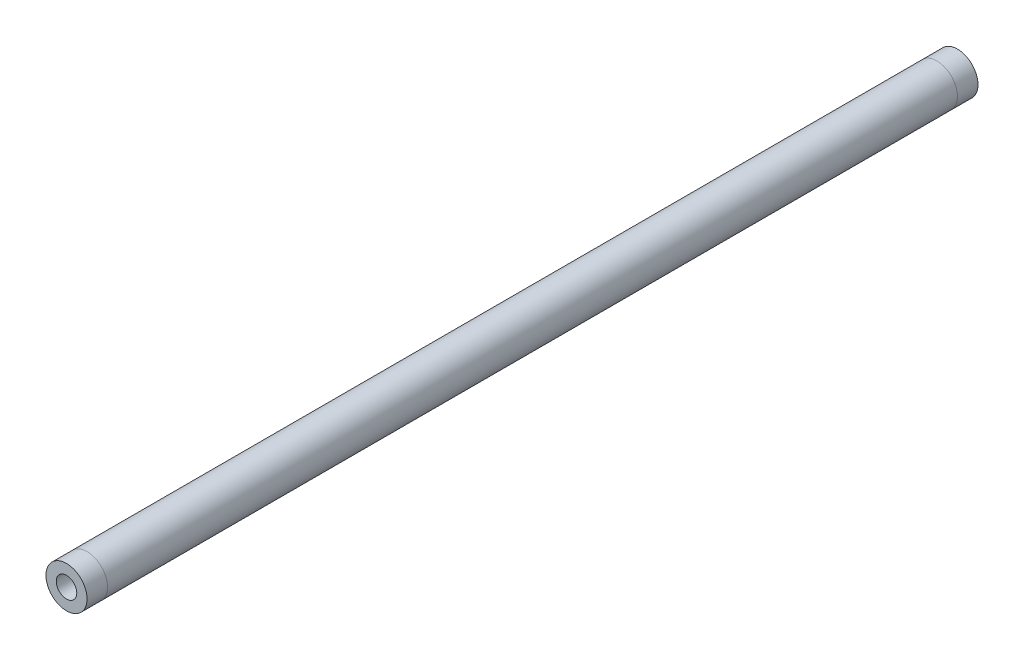
ISO-10303-21;
HEADER;
FILE_DESCRIPTION(('STEP AP214'),'2;1');
FILE_NAME('part.step','',(''),(''),'','','');
FILE_SCHEMA(('AUTOMOTIVE_DESIGN { 1 0 10303 214 1 1 1 1 }'));
ENDSEC;
DATA;
#1=APPLICATION_CONTEXT('core data for automotive mechanical design processes');
#2=APPLICATION_PROTOCOL_DEFINITION('international standard','automotive_design',2000,#1);
#3=PRODUCT_CONTEXT('',#1,'mechanical');
#4=PRODUCT('Part','Part','',(#3));
#5=PRODUCT_RELATED_PRODUCT_CATEGORY('part','',(#4));
#6=PRODUCT_DEFINITION_FORMATION('','',#4);
#7=PRODUCT_DEFINITION_CONTEXT('part definition',#1,'design');
#8=PRODUCT_DEFINITION('design','',#6,#7);
#9=PRODUCT_DEFINITION_SHAPE('','',#8);
#10=(LENGTH_UNIT() NAMED_UNIT(*) SI_UNIT(.MILLI.,.METRE.));
#11=(NAMED_UNIT(*) PLANE_ANGLE_UNIT() SI_UNIT($,.RADIAN.));
#12=(NAMED_UNIT(*) SI_UNIT($,.STERADIAN.) SOLID_ANGLE_UNIT());
#13=UNCERTAINTY_MEASURE_WITH_UNIT(LENGTH_MEASURE(1.E-05),#10,'distance_accuracy_value','');
#14=(GEOMETRIC_REPRESENTATION_CONTEXT(3) GLOBAL_UNCERTAINTY_ASSIGNED_CONTEXT((#13)) GLOBAL_UNIT_ASSIGNED_CONTEXT((#10,
#11,#12)) REPRESENTATION_CONTEXT('',''));
#15=CARTESIAN_POINT('',(0.,0.,0.));
#16=DIRECTION('',(0.,0.,1.));
#17=DIRECTION('',(1.,0.,0.));
#18=AXIS2_PLACEMENT_3D('',#15,#16,#17);
#19=CARTESIAN_POINT('',(0.,0.,-275.364017953208));
#20=DIRECTION('',(0.,0.,1.));
#21=DIRECTION('',(1.,0.,0.));
#22=AXIS2_PLACEMENT_3D('',#19,#20,#21);
#23=CYLINDRICAL_SURFACE('',#22,6.35);
#24=CARTESIAN_POINT('',(0.,0.,-275.364017953208));
#25=DIRECTION('',(0.,0.,1.));
#26=DIRECTION('',(1.,0.,0.));
#27=AXIS2_PLACEMENT_3D('',#24,#25,#26);
#28=CIRCLE('',#27,6.35);
#29=CARTESIAN_POINT('',(6.35,0.,-275.364017953208));
#30=VERTEX_POINT('',#29);
#31=EDGE_CURVE('E89',#30,#30,#28,.T.);
#32=ORIENTED_EDGE('',*,*,#31,.T.);
#33=EDGE_LOOP('',(#32));
#34=FACE_BOUND('',#33,.T.);
#35=CARTESIAN_POINT('',(0.,0.,-269.014017953208));
#36=DIRECTION('',(0.,0.,1.));
#37=DIRECTION('',(1.,0.,0.));
#38=AXIS2_PLACEMENT_3D('',#35,#36,#37);
#39=CIRCLE('',#38,6.35);
#40=CARTESIAN_POINT('',(6.35,0.,-269.014017953208));
#41=VERTEX_POINT('',#40);
#42=EDGE_CURVE('E85',#41,#41,#39,.T.);
#43=ORIENTED_EDGE('',*,*,#42,.F.);
#44=EDGE_LOOP('',(#43));
#45=FACE_BOUND('',#44,.T.);
#46=ADVANCED_FACE('F82',(#34,#45),#23,.T.);
#47=CARTESIAN_POINT('',(0.,0.,-275.364017953208));
#48=DIRECTION('',(0.,0.,1.));
#49=DIRECTION('',(1.,0.,0.));
#50=AXIS2_PLACEMENT_3D('',#47,#48,#49);
#51=PLANE('',#50);
#52=CARTESIAN_POINT('',(0.,0.,-275.364017953208));
#53=DIRECTION('',(0.,0.,1.));
#54=DIRECTION('',(1.,0.,0.));
#55=AXIS2_PLACEMENT_3D('',#52,#53,#54);
#56=CIRCLE('',#55,3.175);
#57=CARTESIAN_POINT('',(3.175,0.,-275.364017953208));
#58=VERTEX_POINT('',#57);
#59=EDGE_CURVE('E98',#58,#58,#56,.T.);
#60=ORIENTED_EDGE('',*,*,#59,.T.);
#61=EDGE_LOOP('',(#60));
#62=FACE_BOUND('',#61,.T.);
#63=ORIENTED_EDGE('',*,*,#31,.F.);
#64=EDGE_LOOP('',(#63));
#65=FACE_BOUND('',#64,.T.);
#66=ADVANCED_FACE('F125',(#62,#65),#51,.F.);
#67=CARTESIAN_POINT('',(0.,0.,-269.014017953208));
#68=DIRECTION('',(0.,0.,1.));
#69=DIRECTION('',(1.,0.,0.));
#70=AXIS2_PLACEMENT_3D('',#67,#68,#69);
#71=PLANE('',#70);
#72=CARTESIAN_POINT('',(0.,0.,-269.014017953208));
#73=DIRECTION('',(0.,0.,1.));
#74=DIRECTION('',(1.,0.,0.));
#75=AXIS2_PLACEMENT_3D('',#72,#73,#74);
#76=CIRCLE('',#75,5.461);
#77=CARTESIAN_POINT('',(-5.461,0.,-269.014017953208));
#78=VERTEX_POINT('',#77);
#79=EDGE_CURVE('E12',#78,#78,#76,.T.);
#80=ORIENTED_EDGE('',*,*,#79,.F.);
#81=EDGE_LOOP('',(#80));
#82=FACE_BOUND('',#81,.T.);
#83=ORIENTED_EDGE('',*,*,#42,.T.);
#84=EDGE_LOOP('',(#83));
#85=FACE_BOUND('',#84,.T.);
#86=ADVANCED_FACE('F121',(#82,#85),#71,.T.);
#87=CARTESIAN_POINT('',(0.,0.,-275.364017953208));
#88=DIRECTION('',(0.,0.,1.));
#89=DIRECTION('',(1.,0.,0.));
#90=AXIS2_PLACEMENT_3D('',#87,#88,#89);
#91=CYLINDRICAL_SURFACE('',#90,3.175);
#92=ORIENTED_EDGE('',*,*,#59,.F.);
#93=EDGE_LOOP('',(#92));
#94=FACE_BOUND('',#93,.T.);
#95=CARTESIAN_POINT('',(0.,0.,-259.489017953208));
#96=DIRECTION('',(0.,0.,1.));
#97=DIRECTION('',(1.,0.,0.));
#98=AXIS2_PLACEMENT_3D('',#95,#96,#97);
#99=CIRCLE('',#98,3.175);
#100=CARTESIAN_POINT('',(3.175,0.,-259.489017953208));
#101=VERTEX_POINT('',#100);
#102=EDGE_CURVE('E104',#101,#101,#99,.T.);
#103=ORIENTED_EDGE('',*,*,#102,.T.);
#104=EDGE_LOOP('',(#103));
#105=FACE_BOUND('',#104,.T.);
#106=ADVANCED_FACE('F110',(#94,#105),#91,.F.);
#107=CARTESIAN_POINT('',(0.,0.,-259.489017953208));
#108=DIRECTION('',(0.,0.,1.));
#109=DIRECTION('',(1.,0.,0.));
#110=AXIS2_PLACEMENT_3D('',#107,#108,#109);
#111=PLANE('',#110);
#112=CARTESIAN_POINT('',(0.,0.,-259.489017953208));
#113=DIRECTION('',(0.,0.,1.));
#114=DIRECTION('',(1.,0.,0.));
#115=AXIS2_PLACEMENT_3D('',#112,#113,#114);
#116=CIRCLE('',#115,5.461);
#117=CARTESIAN_POINT('',(-5.461,0.,-259.489017953208));
#118=VERTEX_POINT('',#117);
#119=EDGE_CURVE('E96',#118,#118,#116,.T.);
#120=ORIENTED_EDGE('',*,*,#119,.T.);
#121=EDGE_LOOP('',(#120));
#122=FACE_BOUND('',#121,.T.);
#123=ORIENTED_EDGE('',*,*,#102,.F.);
#124=EDGE_LOOP('',(#123));
#125=FACE_BOUND('',#124,.T.);
#126=ADVANCED_FACE('F112',(#122,#125),#111,.T.);
#127=CARTESIAN_POINT('',(0.,0.,-259.489017953208));
#128=DIRECTION('',(0.,0.,-1.));
#129=DIRECTION('',(-1.,0.,0.));
#130=AXIS2_PLACEMENT_3D('',#127,#128,#129);
#131=CYLINDRICAL_SURFACE('',#130,5.461);
#132=CARTESIAN_POINT('',(-5.461,0.,-259.489017953208));
#133=CARTESIAN_POINT('',(-5.461,0.,-259.588236703208));
#134=CARTESIAN_POINT('',(-5.461,0.,-259.687455453208));
#135=CARTESIAN_POINT('',(-5.461,0.,-259.885892953208));
#136=CARTESIAN_POINT('',(-5.461,0.,-259.985111703208));
#137=CARTESIAN_POINT('',(-5.461,0.,-260.183549203208));
#138=CARTESIAN_POINT('',(-5.461,0.,-260.282767953208));
#139=CARTESIAN_POINT('',(-5.461,0.,-260.481205453208));
#140=CARTESIAN_POINT('',(-5.461,0.,-260.580424203208));
#141=CARTESIAN_POINT('',(-5.461,0.,-260.778861703208));
#142=CARTESIAN_POINT('',(-5.461,0.,-260.878080453208));
#143=CARTESIAN_POINT('',(-5.461,0.,-261.076517953208));
#144=CARTESIAN_POINT('',(-5.461,0.,-261.175736703208));
#145=CARTESIAN_POINT('',(-5.461,0.,-261.374174203208));
#146=CARTESIAN_POINT('',(-5.461,0.,-261.473392953208));
#147=CARTESIAN_POINT('',(-5.461,0.,-261.671830453208));
#148=CARTESIAN_POINT('',(-5.461,0.,-261.771049203208));
#149=CARTESIAN_POINT('',(-5.461,0.,-261.969486703208));
#150=CARTESIAN_POINT('',(-5.461,0.,-262.068705453208));
#151=CARTESIAN_POINT('',(-5.461,0.,-262.267142953208));
#152=CARTESIAN_POINT('',(-5.461,0.,-262.366361703208));
#153=CARTESIAN_POINT('',(-5.461,0.,-262.564799203208));
#154=CARTESIAN_POINT('',(-5.461,0.,-262.664017953208));
#155=CARTESIAN_POINT('',(-5.461,0.,-262.862455453208));
#156=CARTESIAN_POINT('',(-5.461,0.,-262.961674203208));
#157=CARTESIAN_POINT('',(-5.461,0.,-263.160111703208));
#158=CARTESIAN_POINT('',(-5.461,0.,-263.259330453208));
#159=CARTESIAN_POINT('',(-5.461,0.,-263.457767953208));
#160=CARTESIAN_POINT('',(-5.461,0.,-263.556986703208));
#161=CARTESIAN_POINT('',(-5.461,0.,-263.755424203208));
#162=CARTESIAN_POINT('',(-5.461,0.,-263.854642953208));
#163=CARTESIAN_POINT('',(-5.461,0.,-264.053080453208));
#164=CARTESIAN_POINT('',(-5.461,0.,-264.152299203208));
#165=CARTESIAN_POINT('',(-5.461,0.,-264.350736703208));
#166=CARTESIAN_POINT('',(-5.461,0.,-264.449955453208));
#167=CARTESIAN_POINT('',(-5.461,0.,-264.648392953208));
#168=CARTESIAN_POINT('',(-5.461,0.,-264.747611703208));
#169=CARTESIAN_POINT('',(-5.461,0.,-264.946049203208));
#170=CARTESIAN_POINT('',(-5.461,0.,-265.045267953208));
#171=CARTESIAN_POINT('',(-5.461,0.,-265.243705453208));
#172=CARTESIAN_POINT('',(-5.461,0.,-265.342924203208));
#173=CARTESIAN_POINT('',(-5.461,0.,-265.541361703208));
#174=CARTESIAN_POINT('',(-5.461,0.,-265.640580453208));
#175=CARTESIAN_POINT('',(-5.461,0.,-265.839017953208));
#176=CARTESIAN_POINT('',(-5.461,0.,-265.938236703208));
#177=CARTESIAN_POINT('',(-5.461,0.,-266.136674203208));
#178=CARTESIAN_POINT('',(-5.461,0.,-266.235892953208));
#179=CARTESIAN_POINT('',(-5.461,0.,-266.434330453208));
#180=CARTESIAN_POINT('',(-5.461,0.,-266.533549203208));
#181=CARTESIAN_POINT('',(-5.461,0.,-266.731986703208));
#182=CARTESIAN_POINT('',(-5.461,0.,-266.831205453208));
#183=CARTESIAN_POINT('',(-5.461,0.,-267.029642953208));
#184=CARTESIAN_POINT('',(-5.461,0.,-267.128861703208));
#185=CARTESIAN_POINT('',(-5.461,0.,-267.327299203208));
#186=CARTESIAN_POINT('',(-5.461,0.,-267.426517953208));
#187=CARTESIAN_POINT('',(-5.461,0.,-267.624955453208));
#188=CARTESIAN_POINT('',(-5.461,0.,-267.724174203208));
#189=CARTESIAN_POINT('',(-5.461,0.,-267.922611703208));
#190=CARTESIAN_POINT('',(-5.461,0.,-268.021830453208));
#191=CARTESIAN_POINT('',(-5.461,0.,-268.220267953208));
#192=CARTESIAN_POINT('',(-5.461,0.,-268.319486703208));
#193=CARTESIAN_POINT('',(-5.461,0.,-268.517924203208));
#194=CARTESIAN_POINT('',(-5.461,0.,-268.617142953208));
#195=CARTESIAN_POINT('',(-5.461,0.,-268.815580453208));
#196=CARTESIAN_POINT('',(-5.461,0.,-268.914799203208));
#197=CARTESIAN_POINT('',(-5.461,0.,-269.014017953208));
#198=B_SPLINE_CURVE_WITH_KNOTS('',3,(#132,#133,#134,#135,#136,#137,#138,#139,#140,#141,#142,
#143,#144,#145,#146,#147,#148,#149,#150,#151,#152,#153,#154,#155,#156,#157,#158,#159,#160,#161,
#162,#163,#164,#165,#166,#167,#168,#169,#170,#171,#172,#173,#174,#175,#176,#177,#178,#179,#180,
#181,#182,#183,#184,#185,#186,#187,#188,#189,#190,#191,#192,#193,#194,#195,#196,#197),
.UNSPECIFIED.,.F.,.F.,(4,2,2,2,2,2,2,2,2,2,2,2,2,2,2,2,2,2,2,2,2,2,2,2,2,2,2,2,2,2,2,2,4),(0.,
0.297656249999945,0.595312499999945,0.892968749999945,1.19062499999995,1.48828124999995,
1.78593749999995,2.08359374999995,2.38124999999995,2.67890624999995,2.97656249999995,
3.27421874999995,3.57187499999995,3.86953124999995,4.16718749999995,4.46484374999995,
4.76249999999995,5.06015624999995,5.35781249999995,5.65546874999995,5.95312499999995,
6.25078124999995,6.54843749999995,6.84609374999995,7.14374999999995,7.44140624999995,
7.73906249999995,8.03671874999995,8.33437499999995,8.63203124999995,8.92968749999995,
9.22734374999995,9.52499999999995),.UNSPECIFIED.);
#199=EDGE_CURVE('BSEAM114',#118,#78,#198,.T.);
#200=ORIENTED_EDGE('',*,*,#119,.F.);
#201=ORIENTED_EDGE('',*,*,#79,.T.);
#202=ORIENTED_EDGE('',*,*,#199,.T.);
#203=ORIENTED_EDGE('',*,*,#199,.F.);
#204=EDGE_LOOP('',(#200,#202,#201,#203));
#205=FACE_BOUND('',#204,.T.);
#206=ADVANCED_FACE('F114',(#205),#131,.T.);
#207=CLOSED_SHELL('',(#46,#66,#86,#106,#126,#206));
#208=MANIFOLD_SOLID_BREP('B2',#207);
#209=CARTESIAN_POINT('',(0.,0.,-269.014017953208));
#210=DIRECTION('',(0.,0.,1.));
#211=DIRECTION('',(1.,0.,0.));
#212=AXIS2_PLACEMENT_3D('',#209,#210,#211);
#213=CYLINDRICAL_SURFACE('',#212,6.35);
#214=CARTESIAN_POINT('',(0.,0.,-269.014017953208));
#215=DIRECTION('',(0.,0.,1.));
#216=DIRECTION('',(1.,0.,0.));
#217=AXIS2_PLACEMENT_3D('',#214,#215,#216);
#218=CIRCLE('',#217,6.35);
#219=CARTESIAN_POINT('',(6.35,0.,-269.014017953208));
#220=VERTEX_POINT('',#219);
#221=EDGE_CURVE('E81',#220,#220,#218,.T.);
#222=ORIENTED_EDGE('',*,*,#221,.T.);
#223=EDGE_LOOP('',(#222));
#224=FACE_BOUND('',#223,.T.);
#225=CARTESIAN_POINT('',(0.,0.,-6.35));
#226=DIRECTION('',(0.,0.,1.));
#227=DIRECTION('',(1.,0.,0.));
#228=AXIS2_PLACEMENT_3D('',#225,#226,#227);
#229=CIRCLE('',#228,6.35);
#230=CARTESIAN_POINT('',(6.35,0.,-6.35));
#231=VERTEX_POINT('',#230);
#232=EDGE_CURVE('E197',#231,#231,#229,.T.);
#233=ORIENTED_EDGE('',*,*,#232,.F.);
#234=EDGE_LOOP('',(#233));
#235=FACE_BOUND('',#234,.T.);
#236=ADVANCED_FACE('F194',(#224,#235),#213,.T.);
#237=CARTESIAN_POINT('',(0.,0.,-269.014017953208));
#238=DIRECTION('',(0.,0.,1.));
#239=DIRECTION('',(1.,0.,0.));
#240=AXIS2_PLACEMENT_3D('',#237,#238,#239);
#241=PLANE('',#240);
#242=CARTESIAN_POINT('',(0.,0.,-269.014017953208));
#243=DIRECTION('',(0.,0.,1.));
#244=DIRECTION('',(1.,0.,0.));
#245=AXIS2_PLACEMENT_3D('',#242,#243,#244);
#246=CIRCLE('',#245,5.461);
#247=CARTESIAN_POINT('',(5.461,0.,-269.014017953208));
#248=VERTEX_POINT('',#247);
#249=EDGE_CURVE('E206',#248,#248,#246,.T.);
#250=ORIENTED_EDGE('',*,*,#249,.T.);
#251=EDGE_LOOP('',(#250));
#252=FACE_BOUND('',#251,.T.);
#253=ORIENTED_EDGE('',*,*,#221,.F.);
#254=EDGE_LOOP('',(#253));
#255=FACE_BOUND('',#254,.T.);
#256=ADVANCED_FACE('F216',(#252,#255),#241,.F.);
#257=CARTESIAN_POINT('',(0.,0.,-6.35));
#258=DIRECTION('',(0.,0.,1.));
#259=DIRECTION('',(1.,0.,0.));
#260=AXIS2_PLACEMENT_3D('',#257,#258,#259);
#261=PLANE('',#260);
#262=CARTESIAN_POINT('',(0.,0.,-6.35));
#263=DIRECTION('',(0.,0.,1.));
#264=DIRECTION('',(1.,0.,0.));
#265=AXIS2_PLACEMENT_3D('',#262,#263,#264);
#266=CIRCLE('',#265,5.461);
#267=CARTESIAN_POINT('',(5.461,0.,-6.35));
#268=VERTEX_POINT('',#267);
#269=EDGE_CURVE('E208',#268,#268,#266,.T.);
#270=ORIENTED_EDGE('',*,*,#269,.F.);
#271=EDGE_LOOP('',(#270));
#272=FACE_BOUND('',#271,.T.);
#273=ORIENTED_EDGE('',*,*,#232,.T.);
#274=EDGE_LOOP('',(#273));
#275=FACE_BOUND('',#274,.T.);
#276=ADVANCED_FACE('F222',(#272,#275),#261,.T.);
#277=CARTESIAN_POINT('',(0.,0.,-269.014017953208));
#278=DIRECTION('',(0.,0.,1.));
#279=DIRECTION('',(1.,0.,0.));
#280=AXIS2_PLACEMENT_3D('',#277,#278,#279);
#281=CYLINDRICAL_SURFACE('',#280,5.461);
#282=ORIENTED_EDGE('',*,*,#249,.F.);
#283=EDGE_LOOP('',(#282));
#284=FACE_BOUND('',#283,.T.);
#285=ORIENTED_EDGE('',*,*,#269,.T.);
#286=EDGE_LOOP('',(#285));
#287=FACE_BOUND('',#286,.T.);
#288=ADVANCED_FACE('F219',(#284,#287),#281,.F.);
#289=CLOSED_SHELL('',(#236,#256,#276,#288));
#290=MANIFOLD_SOLID_BREP('B7',#289);
#291=CARTESIAN_POINT('',(0.,0.,-6.35));
#292=DIRECTION('',(0.,0.,1.));
#293=DIRECTION('',(1.,0.,0.));
#294=AXIS2_PLACEMENT_3D('',#291,#292,#293);
#295=CYLINDRICAL_SURFACE('',#294,6.35);
#296=CARTESIAN_POINT('',(0.,0.,-6.35));
#297=DIRECTION('',(0.,0.,1.));
#298=DIRECTION('',(1.,0.,0.));
#299=AXIS2_PLACEMENT_3D('',#296,#297,#298);
#300=CIRCLE('',#299,6.35);
#301=CARTESIAN_POINT('',(6.35,0.,-6.35));
#302=VERTEX_POINT('',#301);
#303=EDGE_CURVE('E193',#302,#302,#300,.T.);
#304=ORIENTED_EDGE('',*,*,#303,.T.);
#305=EDGE_LOOP('',(#304));
#306=FACE_BOUND('',#305,.T.);
#307=CARTESIAN_POINT('',(0.,0.,0.));
#308=DIRECTION('',(0.,0.,1.));
#309=DIRECTION('',(1.,0.,0.));
#310=AXIS2_PLACEMENT_3D('',#307,#308,#309);
#311=CIRCLE('',#310,6.35);
#312=CARTESIAN_POINT('',(6.35,0.,0.));
#313=VERTEX_POINT('',#312);
#314=EDGE_CURVE('E271',#313,#313,#311,.T.);
#315=ORIENTED_EDGE('',*,*,#314,.F.);
#316=EDGE_LOOP('',(#315));
#317=FACE_BOUND('',#316,.T.);
#318=ADVANCED_FACE('F260',(#306,#317),#295,.T.);
#319=CARTESIAN_POINT('',(0.,0.,-6.35));
#320=DIRECTION('',(0.,0.,1.));
#321=DIRECTION('',(1.,0.,0.));
#322=AXIS2_PLACEMENT_3D('',#319,#320,#321);
#323=CYLINDRICAL_SURFACE('',#322,3.175);
#324=CARTESIAN_POINT('',(0.,0.,0.));
#325=DIRECTION('',(0.,0.,1.));
#326=DIRECTION('',(1.,0.,0.));
#327=AXIS2_PLACEMENT_3D('',#324,#325,#326);
#328=CIRCLE('',#327,3.175);
#329=CARTESIAN_POINT('',(3.175,0.,0.));
#330=VERTEX_POINT('',#329);
#331=EDGE_CURVE('E263',#330,#330,#328,.T.);
#332=ORIENTED_EDGE('',*,*,#331,.T.);
#333=EDGE_LOOP('',(#332));
#334=FACE_BOUND('',#333,.T.);
#335=CARTESIAN_POINT('',(0.,0.,-15.875));
#336=DIRECTION('',(0.,0.,1.));
#337=DIRECTION('',(1.,0.,0.));
#338=AXIS2_PLACEMENT_3D('',#335,#336,#337);
#339=CIRCLE('',#338,3.175);
#340=CARTESIAN_POINT('',(3.175,0.,-15.875));
#341=VERTEX_POINT('',#340);
#342=EDGE_CURVE('E283',#341,#341,#339,.T.);
#343=ORIENTED_EDGE('',*,*,#342,.F.);
#344=EDGE_LOOP('',(#343));
#345=FACE_BOUND('',#344,.T.);
#346=ADVANCED_FACE('F291',(#334,#345),#323,.F.);
#347=CARTESIAN_POINT('',(0.,0.,-6.35));
#348=DIRECTION('',(0.,0.,1.));
#349=DIRECTION('',(1.,0.,0.));
#350=AXIS2_PLACEMENT_3D('',#347,#348,#349);
#351=PLANE('',#350);
#352=CARTESIAN_POINT('',(0.,0.,-6.35));
#353=DIRECTION('',(0.,0.,1.));
#354=DIRECTION('',(1.,0.,0.));
#355=AXIS2_PLACEMENT_3D('',#352,#353,#354);
#356=CIRCLE('',#355,5.461);
#357=CARTESIAN_POINT('',(5.461,0.,-6.35));
#358=VERTEX_POINT('',#357);
#359=EDGE_CURVE('E273',#358,#358,#356,.T.);
#360=ORIENTED_EDGE('',*,*,#359,.T.);
#361=EDGE_LOOP('',(#360));
#362=FACE_BOUND('',#361,.T.);
#363=ORIENTED_EDGE('',*,*,#303,.F.);
#364=EDGE_LOOP('',(#363));
#365=FACE_BOUND('',#364,.T.);
#366=ADVANCED_FACE('F293',(#362,#365),#351,.F.);
#367=CARTESIAN_POINT('',(0.,0.,0.));
#368=DIRECTION('',(0.,0.,1.));
#369=DIRECTION('',(1.,0.,0.));
#370=AXIS2_PLACEMENT_3D('',#367,#368,#369);
#371=PLANE('',#370);
#372=ORIENTED_EDGE('',*,*,#314,.T.);
#373=EDGE_LOOP('',(#372));
#374=FACE_BOUND('',#373,.T.);
#375=ORIENTED_EDGE('',*,*,#331,.F.);
#376=EDGE_LOOP('',(#375));
#377=FACE_BOUND('',#376,.T.);
#378=ADVANCED_FACE('F299',(#374,#377),#371,.T.);
#379=CARTESIAN_POINT('',(0.,0.,-15.875));
#380=DIRECTION('',(0.,0.,1.));
#381=DIRECTION('',(1.,0.,0.));
#382=AXIS2_PLACEMENT_3D('',#379,#380,#381);
#383=CYLINDRICAL_SURFACE('',#382,5.461);
#384=CARTESIAN_POINT('',(0.,0.,-15.875));
#385=DIRECTION('',(0.,0.,1.));
#386=DIRECTION('',(1.,0.,0.));
#387=AXIS2_PLACEMENT_3D('',#384,#385,#386);
#388=CIRCLE('',#387,5.461);
#389=CARTESIAN_POINT('',(5.461,0.,-15.875));
#390=VERTEX_POINT('',#389);
#391=EDGE_CURVE('E276',#390,#390,#388,.T.);
#392=CARTESIAN_POINT('',(5.461,0.,-15.875));
#393=CARTESIAN_POINT('',(5.461,0.,-15.77578125));
#394=CARTESIAN_POINT('',(5.461,0.,-15.6765625));
#395=CARTESIAN_POINT('',(5.461,0.,-15.478125));
#396=CARTESIAN_POINT('',(5.461,0.,-15.37890625));
#397=CARTESIAN_POINT('',(5.461,0.,-15.18046875));
#398=CARTESIAN_POINT('',(5.461,0.,-15.08125));
#399=CARTESIAN_POINT('',(5.461,0.,-14.8828125));
#400=CARTESIAN_POINT('',(5.461,0.,-14.78359375));
#401=CARTESIAN_POINT('',(5.461,0.,-14.58515625));
#402=CARTESIAN_POINT('',(5.461,0.,-14.4859375));
#403=CARTESIAN_POINT('',(5.461,0.,-14.2875));
#404=CARTESIAN_POINT('',(5.461,0.,-14.18828125));
#405=CARTESIAN_POINT('',(5.461,0.,-13.98984375));
#406=CARTESIAN_POINT('',(5.461,0.,-13.890625));
#407=CARTESIAN_POINT('',(5.461,0.,-13.6921875));
#408=CARTESIAN_POINT('',(5.461,0.,-13.59296875));
#409=CARTESIAN_POINT('',(5.461,0.,-13.39453125));
#410=CARTESIAN_POINT('',(5.461,0.,-13.2953125));
#411=CARTESIAN_POINT('',(5.461,0.,-13.096875));
#412=CARTESIAN_POINT('',(5.461,0.,-12.99765625));
#413=CARTESIAN_POINT('',(5.461,0.,-12.79921875));
#414=CARTESIAN_POINT('',(5.461,0.,-12.7));
#415=CARTESIAN_POINT('',(5.461,0.,-12.5015625));
#416=CARTESIAN_POINT('',(5.461,0.,-12.40234375));
#417=CARTESIAN_POINT('',(5.461,0.,-12.20390625));
#418=CARTESIAN_POINT('',(5.461,0.,-12.1046875));
#419=CARTESIAN_POINT('',(5.461,0.,-11.90625));
#420=CARTESIAN_POINT('',(5.461,0.,-11.80703125));
#421=CARTESIAN_POINT('',(5.461,0.,-11.60859375));
#422=CARTESIAN_POINT('',(5.461,0.,-11.509375));
#423=CARTESIAN_POINT('',(5.461,0.,-11.3109375));
#424=CARTESIAN_POINT('',(5.461,0.,-11.21171875));
#425=CARTESIAN_POINT('',(5.461,0.,-11.01328125));
#426=CARTESIAN_POINT('',(5.461,0.,-10.9140625));
#427=CARTESIAN_POINT('',(5.461,0.,-10.715625));
#428=CARTESIAN_POINT('',(5.461,0.,-10.61640625));
#429=CARTESIAN_POINT('',(5.461,0.,-10.41796875));
#430=CARTESIAN_POINT('',(5.461,0.,-10.31875));
#431=CARTESIAN_POINT('',(5.461,0.,-10.1203125));
#432=CARTESIAN_POINT('',(5.461,0.,-10.02109375));
#433=CARTESIAN_POINT('',(5.461,0.,-9.82265625));
#434=CARTESIAN_POINT('',(5.461,0.,-9.7234375));
#435=CARTESIAN_POINT('',(5.461,0.,-9.525));
#436=CARTESIAN_POINT('',(5.461,0.,-9.42578125));
#437=CARTESIAN_POINT('',(5.461,0.,-9.22734375));
#438=CARTESIAN_POINT('',(5.461,0.,-9.128125));
#439=CARTESIAN_POINT('',(5.461,0.,-8.9296875));
#440=CARTESIAN_POINT('',(5.461,0.,-8.83046875));
#441=CARTESIAN_POINT('',(5.461,0.,-8.63203125));
#442=CARTESIAN_POINT('',(5.461,0.,-8.5328125));
#443=CARTESIAN_POINT('',(5.461,0.,-8.334375));
#444=CARTESIAN_POINT('',(5.461,0.,-8.23515625));
#445=CARTESIAN_POINT('',(5.461,0.,-8.03671875));
#446=CARTESIAN_POINT('',(5.461,0.,-7.9375));
#447=CARTESIAN_POINT('',(5.461,0.,-7.7390625));
#448=CARTESIAN_POINT('',(5.461,0.,-7.63984375));
#449=CARTESIAN_POINT('',(5.461,0.,-7.44140625));
#450=CARTESIAN_POINT('',(5.461,0.,-7.3421875));
#451=CARTESIAN_POINT('',(5.461,0.,-7.14375));
#452=CARTESIAN_POINT('',(5.461,0.,-7.04453125));
#453=CARTESIAN_POINT('',(5.461,0.,-6.84609375));
#454=CARTESIAN_POINT('',(5.461,0.,-6.746875));
#455=CARTESIAN_POINT('',(5.461,0.,-6.5484375));
#456=CARTESIAN_POINT('',(5.461,0.,-6.44921875));
#457=CARTESIAN_POINT('',(5.461,0.,-6.35));
#458=B_SPLINE_CURVE_WITH_KNOTS('',3,(#392,#393,#394,#395,#396,#397,#398,#399,#400,#401,#402,
#403,#404,#405,#406,#407,#408,#409,#410,#411,#412,#413,#414,#415,#416,#417,#418,#419,#420,#421,
#422,#423,#424,#425,#426,#427,#428,#429,#430,#431,#432,#433,#434,#435,#436,#437,#438,#439,#440,
#441,#442,#443,#444,#445,#446,#447,#448,#449,#450,#451,#452,#453,#454,#455,#456,#457),
.UNSPECIFIED.,.F.,.F.,(4,2,2,2,2,2,2,2,2,2,2,2,2,2,2,2,2,2,2,2,2,2,2,2,2,2,2,2,2,2,2,2,4),(0.,
0.297656250000002,0.595312500000002,0.892968750000002,1.190625,1.48828125,1.7859375,2.08359375,
2.38125,2.67890625,2.9765625,3.27421875,3.571875,3.86953125,4.1671875,4.46484375,4.7625,
5.06015625,5.3578125,5.65546875,5.953125,6.25078125,6.5484375,6.84609375,7.14375,7.44140625,
7.7390625,8.03671875,8.334375,8.63203125,8.9296875,9.22734375,9.525),.UNSPECIFIED.);
#459=EDGE_CURVE('BSEAM304',#390,#358,#458,.T.);
#460=ORIENTED_EDGE('',*,*,#391,.T.);
#461=ORIENTED_EDGE('',*,*,#359,.F.);
#462=ORIENTED_EDGE('',*,*,#459,.T.);
#463=ORIENTED_EDGE('',*,*,#459,.F.);
#464=EDGE_LOOP('',(#460,#462,#461,#463));
#465=FACE_BOUND('',#464,.T.);
#466=ADVANCED_FACE('F304',(#465),#383,.T.);
#467=CARTESIAN_POINT('',(0.,0.,-15.875));
#468=DIRECTION('',(0.,0.,1.));
#469=DIRECTION('',(1.,0.,0.));
#470=AXIS2_PLACEMENT_3D('',#467,#468,#469);
#471=PLANE('',#470);
#472=ORIENTED_EDGE('',*,*,#342,.T.);
#473=EDGE_LOOP('',(#472));
#474=FACE_BOUND('',#473,.T.);
#475=ORIENTED_EDGE('',*,*,#391,.F.);
#476=EDGE_LOOP('',(#475));
#477=FACE_BOUND('',#476,.T.);
#478=ADVANCED_FACE('F288',(#474,#477),#471,.F.);
#479=CLOSED_SHELL('',(#318,#346,#366,#378,#466,#478));
#480=MANIFOLD_SOLID_BREP('B76',#479);
#481=ADVANCED_BREP_SHAPE_REPRESENTATION('',(#18,#208,#290,#480),#14);
#482=SHAPE_DEFINITION_REPRESENTATION(#9,#481);
ENDSEC;
END-ISO-10303-21;
